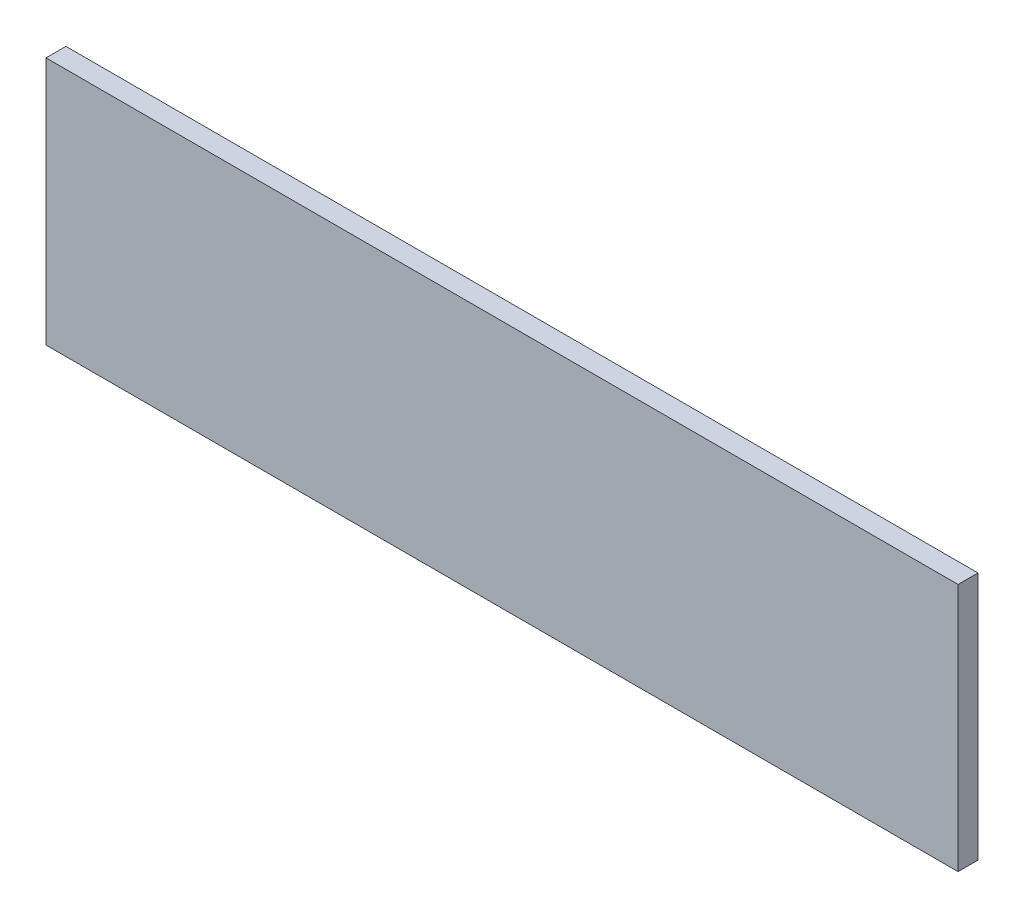
ISO-10303-21;
HEADER;
FILE_DESCRIPTION(('STEP AP214'),'2;1');
FILE_NAME('part.step','',(''),(''),'','','');
FILE_SCHEMA(('AUTOMOTIVE_DESIGN { 1 0 10303 214 1 1 1 1 }'));
ENDSEC;
DATA;
#1=APPLICATION_CONTEXT('core data for automotive mechanical design processes');
#2=APPLICATION_PROTOCOL_DEFINITION('international standard','automotive_design',2000,#1);
#3=PRODUCT_CONTEXT('',#1,'mechanical');
#4=PRODUCT('Part','Part','',(#3));
#5=PRODUCT_RELATED_PRODUCT_CATEGORY('part','',(#4));
#6=PRODUCT_DEFINITION_FORMATION('','',#4);
#7=PRODUCT_DEFINITION_CONTEXT('part definition',#1,'design');
#8=PRODUCT_DEFINITION('design','',#6,#7);
#9=PRODUCT_DEFINITION_SHAPE('','',#8);
#10=(LENGTH_UNIT() NAMED_UNIT(*) SI_UNIT(.MILLI.,.METRE.));
#11=(NAMED_UNIT(*) PLANE_ANGLE_UNIT() SI_UNIT($,.RADIAN.));
#12=(NAMED_UNIT(*) SI_UNIT($,.STERADIAN.) SOLID_ANGLE_UNIT());
#13=UNCERTAINTY_MEASURE_WITH_UNIT(LENGTH_MEASURE(1.E-05),#10,'distance_accuracy_value','');
#14=(GEOMETRIC_REPRESENTATION_CONTEXT(3) GLOBAL_UNCERTAINTY_ASSIGNED_CONTEXT((#13)) GLOBAL_UNIT_ASSIGNED_CONTEXT((#10,
#11,#12)) REPRESENTATION_CONTEXT('',''));
#15=CARTESIAN_POINT('',(0.,0.,0.));
#16=DIRECTION('',(0.,0.,1.));
#17=DIRECTION('',(1.,0.,0.));
#18=AXIS2_PLACEMENT_3D('',#15,#16,#17);
#19=CARTESIAN_POINT('',(51.,12.4459813156576,133.442125645559));
#20=DIRECTION('',(1.,0.,0.));
#21=DIRECTION('',(0.,0.,-1.));
#22=AXIS2_PLACEMENT_3D('',#19,#20,#21);
#23=PLANE('',#22);
#24=DIRECTION('',(0.,-1.,0.));
#25=VECTOR('',#24,1.);
#26=CARTESIAN_POINT('',(51.,12.4459813156576,128.442125645559));
#27=LINE('',#26,#25);
#28=CARTESIAN_POINT('',(51.,12.4459813156576,128.442125645559));
#29=VERTEX_POINT('',#28);
#30=CARTESIAN_POINT('',(51.,-50.,128.442125645559));
#31=VERTEX_POINT('',#30);
#32=EDGE_CURVE('E103',#29,#31,#27,.T.);
#33=ORIENTED_EDGE('',*,*,#32,.T.);
#34=DIRECTION('',(0.,0.,-1.));
#35=VECTOR('',#34,1.);
#36=CARTESIAN_POINT('',(51.,-50.,133.442125645559));
#37=LINE('',#36,#35);
#38=CARTESIAN_POINT('',(51.,-50.,133.442125645559));
#39=VERTEX_POINT('',#38);
#40=EDGE_CURVE('E11',#39,#31,#37,.T.);
#41=ORIENTED_EDGE('',*,*,#40,.F.);
#42=DIRECTION('',(0.,-1.,0.));
#43=VECTOR('',#42,1.);
#44=CARTESIAN_POINT('',(51.,12.4459813156576,133.442125645559));
#45=LINE('',#44,#43);
#46=CARTESIAN_POINT('',(51.,12.4459813156576,133.442125645559));
#47=VERTEX_POINT('',#46);
#48=EDGE_CURVE('E91',#47,#39,#45,.T.);
#49=ORIENTED_EDGE('',*,*,#48,.F.);
#50=DIRECTION('',(0.,0.,-1.));
#51=VECTOR('',#50,1.);
#52=CARTESIAN_POINT('',(51.,12.4459813156576,133.442125645559));
#53=LINE('',#52,#51);
#54=EDGE_CURVE('E99',#47,#29,#53,.T.);
#55=ORIENTED_EDGE('',*,*,#54,.T.);
#56=EDGE_LOOP('',(#33,#41,#49,#55));
#57=FACE_BOUND('',#56,.T.);
#58=ADVANCED_FACE('F40',(#57),#23,.F.);
#59=CARTESIAN_POINT('',(51.,-50.,133.442125645559));
#60=DIRECTION('',(0.,1.,0.));
#61=DIRECTION('',(0.,0.,1.));
#62=AXIS2_PLACEMENT_3D('',#59,#60,#61);
#63=PLANE('',#62);
#64=DIRECTION('',(1.,0.,0.));
#65=VECTOR('',#64,1.);
#66=CARTESIAN_POINT('',(51.,-50.,128.442125645559));
#67=LINE('',#66,#65);
#68=CARTESIAN_POINT('',(280.,-50.,128.442125645559));
#69=VERTEX_POINT('',#68);
#70=EDGE_CURVE('E95',#31,#69,#67,.T.);
#71=ORIENTED_EDGE('',*,*,#70,.T.);
#72=DIRECTION('',(0.,0.,-1.));
#73=VECTOR('',#72,1.);
#74=CARTESIAN_POINT('',(280.,-50.,133.442125645559));
#75=LINE('',#74,#73);
#76=CARTESIAN_POINT('',(280.,-50.,133.442125645559));
#77=VERTEX_POINT('',#76);
#78=EDGE_CURVE('E48',#77,#69,#75,.T.);
#79=ORIENTED_EDGE('',*,*,#78,.F.);
#80=DIRECTION('',(1.,0.,0.));
#81=VECTOR('',#80,1.);
#82=CARTESIAN_POINT('',(51.,-50.,133.442125645559));
#83=LINE('',#82,#81);
#84=EDGE_CURVE('E86',#39,#77,#83,.T.);
#85=ORIENTED_EDGE('',*,*,#84,.F.);
#86=ORIENTED_EDGE('',*,*,#40,.T.);
#87=EDGE_LOOP('',(#71,#79,#85,#86));
#88=FACE_BOUND('',#87,.T.);
#89=ADVANCED_FACE('F94',(#88),#63,.F.);
#90=CARTESIAN_POINT('',(280.,12.4459813156576,133.442125645559));
#91=DIRECTION('',(-1.,0.,0.));
#92=DIRECTION('',(0.,0.,1.));
#93=AXIS2_PLACEMENT_3D('',#90,#91,#92);
#94=PLANE('',#93);
#95=DIRECTION('',(0.,1.,0.));
#96=VECTOR('',#95,1.);
#97=CARTESIAN_POINT('',(280.,12.4459813156576,128.442125645559));
#98=LINE('',#97,#96);
#99=CARTESIAN_POINT('',(280.,12.4459813156576,128.442125645559));
#100=VERTEX_POINT('',#99);
#101=EDGE_CURVE('E73',#69,#100,#98,.T.);
#102=ORIENTED_EDGE('',*,*,#101,.T.);
#103=DIRECTION('',(0.,0.,-1.));
#104=VECTOR('',#103,1.);
#105=CARTESIAN_POINT('',(280.,12.4459813156576,133.442125645559));
#106=LINE('',#105,#104);
#107=CARTESIAN_POINT('',(280.,12.4459813156576,133.442125645559));
#108=VERTEX_POINT('',#107);
#109=EDGE_CURVE('E96',#108,#100,#106,.T.);
#110=ORIENTED_EDGE('',*,*,#109,.F.);
#111=DIRECTION('',(0.,1.,0.));
#112=VECTOR('',#111,1.);
#113=CARTESIAN_POINT('',(280.,12.4459813156576,133.442125645559));
#114=LINE('',#113,#112);
#115=EDGE_CURVE('E89',#77,#108,#114,.T.);
#116=ORIENTED_EDGE('',*,*,#115,.F.);
#117=ORIENTED_EDGE('',*,*,#78,.T.);
#118=EDGE_LOOP('',(#102,#110,#116,#117));
#119=FACE_BOUND('',#118,.T.);
#120=ADVANCED_FACE('F97',(#119),#94,.F.);
#121=CARTESIAN_POINT('',(51.,12.4459813156576,133.442125645559));
#122=DIRECTION('',(0.,-1.,0.));
#123=DIRECTION('',(0.,0.,-1.));
#124=AXIS2_PLACEMENT_3D('',#121,#122,#123);
#125=PLANE('',#124);
#126=DIRECTION('',(-1.,0.,0.));
#127=VECTOR('',#126,1.);
#128=CARTESIAN_POINT('',(51.,12.4459813156576,128.442125645559));
#129=LINE('',#128,#127);
#130=EDGE_CURVE('E79',#100,#29,#129,.T.);
#131=ORIENTED_EDGE('',*,*,#130,.T.);
#132=ORIENTED_EDGE('',*,*,#54,.F.);
#133=DIRECTION('',(-1.,0.,0.));
#134=VECTOR('',#133,1.);
#135=CARTESIAN_POINT('',(51.,12.4459813156576,133.442125645559));
#136=LINE('',#135,#134);
#137=EDGE_CURVE('E56',#108,#47,#136,.T.);
#138=ORIENTED_EDGE('',*,*,#137,.F.);
#139=ORIENTED_EDGE('',*,*,#109,.T.);
#140=EDGE_LOOP('',(#131,#132,#138,#139));
#141=FACE_BOUND('',#140,.T.);
#142=ADVANCED_FACE('F110',(#141),#125,.F.);
#143=CARTESIAN_POINT('',(0.,0.,133.442125645559));
#144=DIRECTION('',(0.,0.,1.));
#145=DIRECTION('',(1.,0.,0.));
#146=AXIS2_PLACEMENT_3D('',#143,#144,#145);
#147=PLANE('',#146);
#148=ORIENTED_EDGE('',*,*,#48,.T.);
#149=ORIENTED_EDGE('',*,*,#84,.T.);
#150=ORIENTED_EDGE('',*,*,#115,.T.);
#151=ORIENTED_EDGE('',*,*,#137,.T.);
#152=EDGE_LOOP('',(#148,#149,#150,#151));
#153=FACE_BOUND('',#152,.T.);
#154=ADVANCED_FACE('F87',(#153),#147,.T.);
#155=CARTESIAN_POINT('',(0.,0.,128.442125645559));
#156=DIRECTION('',(0.,0.,1.));
#157=DIRECTION('',(1.,0.,0.));
#158=AXIS2_PLACEMENT_3D('',#155,#156,#157);
#159=PLANE('',#158);
#160=ORIENTED_EDGE('',*,*,#32,.F.);
#161=ORIENTED_EDGE('',*,*,#130,.F.);
#162=ORIENTED_EDGE('',*,*,#101,.F.);
#163=ORIENTED_EDGE('',*,*,#70,.F.);
#164=EDGE_LOOP('',(#160,#161,#162,#163));
#165=FACE_BOUND('',#164,.T.);
#166=ADVANCED_FACE('F113',(#165),#159,.F.);
#167=CLOSED_SHELL('',(#58,#89,#120,#142,#154,#166));
#168=MANIFOLD_SOLID_BREP('B2',#167);
#169=ADVANCED_BREP_SHAPE_REPRESENTATION('',(#18,#168),#14);
#170=SHAPE_DEFINITION_REPRESENTATION(#9,#169);
ENDSEC;
END-ISO-10303-21;
